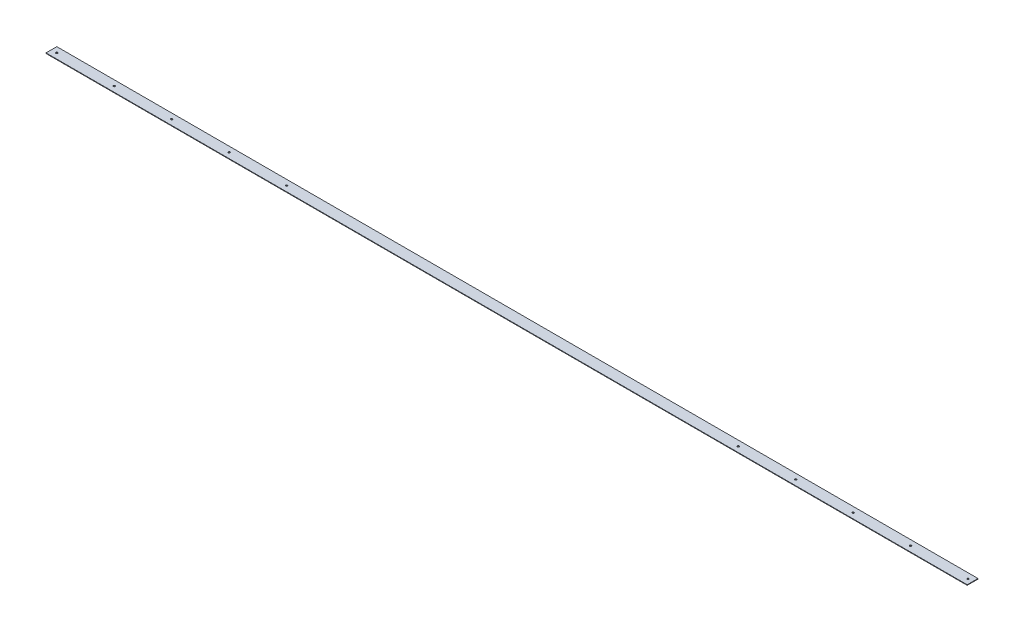
ISO-10303-21;
HEADER;
FILE_DESCRIPTION(('STEP AP214'),'2;1');
FILE_NAME('part.step','',(''),(''),'','','');
FILE_SCHEMA(('AUTOMOTIVE_DESIGN { 1 0 10303 214 1 1 1 1 }'));
ENDSEC;
DATA;
#1=APPLICATION_CONTEXT('core data for automotive mechanical design processes');
#2=APPLICATION_PROTOCOL_DEFINITION('international standard','automotive_design',2000,#1);
#3=PRODUCT_CONTEXT('',#1,'mechanical');
#4=PRODUCT('Part','Part','',(#3));
#5=PRODUCT_RELATED_PRODUCT_CATEGORY('part','',(#4));
#6=PRODUCT_DEFINITION_FORMATION('','',#4);
#7=PRODUCT_DEFINITION_CONTEXT('part definition',#1,'design');
#8=PRODUCT_DEFINITION('design','',#6,#7);
#9=PRODUCT_DEFINITION_SHAPE('','',#8);
#10=(LENGTH_UNIT() NAMED_UNIT(*) SI_UNIT(.MILLI.,.METRE.));
#11=(NAMED_UNIT(*) PLANE_ANGLE_UNIT() SI_UNIT($,.RADIAN.));
#12=(NAMED_UNIT(*) SI_UNIT($,.STERADIAN.) SOLID_ANGLE_UNIT());
#13=UNCERTAINTY_MEASURE_WITH_UNIT(LENGTH_MEASURE(1.E-05),#10,'distance_accuracy_value','');
#14=(GEOMETRIC_REPRESENTATION_CONTEXT(3) GLOBAL_UNCERTAINTY_ASSIGNED_CONTEXT((#13)) GLOBAL_UNIT_ASSIGNED_CONTEXT((#10,
#11,#12)) REPRESENTATION_CONTEXT('',''));
#15=CARTESIAN_POINT('',(0.,0.,0.));
#16=DIRECTION('',(0.,0.,1.));
#17=DIRECTION('',(1.,0.,0.));
#18=AXIS2_PLACEMENT_3D('',#15,#16,#17);
#19=CARTESIAN_POINT('',(-1704.25,2.,20.0000000000002));
#20=DIRECTION('',(1.,0.,0.));
#21=DIRECTION('',(0.,0.,-1.));
#22=AXIS2_PLACEMENT_3D('',#19,#20,#21);
#23=PLANE('',#22);
#24=DIRECTION('',(0.,0.,1.));
#25=VECTOR('',#24,1.);
#26=CARTESIAN_POINT('',(-1704.25,0.,20.0000000000002));
#27=LINE('',#26,#25);
#28=CARTESIAN_POINT('',(-1704.25,0.,-19.9999999999998));
#29=VERTEX_POINT('',#28);
#30=CARTESIAN_POINT('',(-1704.25,0.,20.0000000000002));
#31=VERTEX_POINT('',#30);
#32=EDGE_CURVE('E101',#29,#31,#27,.T.);
#33=ORIENTED_EDGE('',*,*,#32,.T.);
#34=DIRECTION('',(0.,-1.,0.));
#35=VECTOR('',#34,1.);
#36=CARTESIAN_POINT('',(-1704.25,2.,20.0000000000002));
#37=LINE('',#36,#35);
#38=CARTESIAN_POINT('',(-1704.25,2.,20.0000000000002));
#39=VERTEX_POINT('',#38);
#40=EDGE_CURVE('E11',#39,#31,#37,.T.);
#41=ORIENTED_EDGE('',*,*,#40,.F.);
#42=DIRECTION('',(0.,0.,1.));
#43=VECTOR('',#42,1.);
#44=CARTESIAN_POINT('',(-1704.25,2.,20.0000000000002));
#45=LINE('',#44,#43);
#46=CARTESIAN_POINT('',(-1704.25,2.,-19.9999999999998));
#47=VERTEX_POINT('',#46);
#48=EDGE_CURVE('E88',#47,#39,#45,.T.);
#49=ORIENTED_EDGE('',*,*,#48,.F.);
#50=DIRECTION('',(0.,-1.,0.));
#51=VECTOR('',#50,1.);
#52=CARTESIAN_POINT('',(-1704.25,2.,-19.9999999999998));
#53=LINE('',#52,#51);
#54=EDGE_CURVE('E97',#47,#29,#53,.T.);
#55=ORIENTED_EDGE('',*,*,#54,.T.);
#56=EDGE_LOOP('',(#33,#41,#49,#55));
#57=FACE_BOUND('',#56,.T.);
#58=ADVANCED_FACE('F35',(#57),#23,.F.);
#59=CARTESIAN_POINT('',(1704.25,2.,19.9999999999998));
#60=DIRECTION('',(0.,0.,-1.));
#61=DIRECTION('',(-1.,0.,0.));
#62=AXIS2_PLACEMENT_3D('',#59,#60,#61);
#63=PLANE('',#62);
#64=DIRECTION('',(1.,0.,0.));
#65=VECTOR('',#64,1.);
#66=CARTESIAN_POINT('',(1704.25,0.,19.9999999999998));
#67=LINE('',#66,#65);
#68=CARTESIAN_POINT('',(1704.25,0.,19.9999999999998));
#69=VERTEX_POINT('',#68);
#70=EDGE_CURVE('E92',#31,#69,#67,.T.);
#71=ORIENTED_EDGE('',*,*,#70,.T.);
#72=DIRECTION('',(0.,-1.,0.));
#73=VECTOR('',#72,1.);
#74=CARTESIAN_POINT('',(1704.25,2.,19.9999999999998));
#75=LINE('',#74,#73);
#76=CARTESIAN_POINT('',(1704.25,2.,19.9999999999998));
#77=VERTEX_POINT('',#76);
#78=EDGE_CURVE('E44',#77,#69,#75,.T.);
#79=ORIENTED_EDGE('',*,*,#78,.F.);
#80=DIRECTION('',(1.,0.,0.));
#81=VECTOR('',#80,1.);
#82=CARTESIAN_POINT('',(1704.25,2.,19.9999999999998));
#83=LINE('',#82,#81);
#84=EDGE_CURVE('E83',#39,#77,#83,.T.);
#85=ORIENTED_EDGE('',*,*,#84,.F.);
#86=ORIENTED_EDGE('',*,*,#40,.T.);
#87=EDGE_LOOP('',(#71,#79,#85,#86));
#88=FACE_BOUND('',#87,.T.);
#89=ADVANCED_FACE('F91',(#88),#63,.F.);
#90=CARTESIAN_POINT('',(1704.25,2.,19.9999999999998));
#91=DIRECTION('',(-1.,0.,0.));
#92=DIRECTION('',(0.,0.,1.));
#93=AXIS2_PLACEMENT_3D('',#90,#91,#92);
#94=PLANE('',#93);
#95=DIRECTION('',(0.,0.,-1.));
#96=VECTOR('',#95,1.);
#97=CARTESIAN_POINT('',(1704.25,0.,19.9999999999998));
#98=LINE('',#97,#96);
#99=CARTESIAN_POINT('',(1704.25,0.,-20.0000000000002));
#100=VERTEX_POINT('',#99);
#101=EDGE_CURVE('E70',#69,#100,#98,.T.);
#102=ORIENTED_EDGE('',*,*,#101,.T.);
#103=DIRECTION('',(0.,-1.,0.));
#104=VECTOR('',#103,1.);
#105=CARTESIAN_POINT('',(1704.25,2.,-20.0000000000002));
#106=LINE('',#105,#104);
#107=CARTESIAN_POINT('',(1704.25,2.,-20.0000000000002));
#108=VERTEX_POINT('',#107);
#109=EDGE_CURVE('E93',#108,#100,#106,.T.);
#110=ORIENTED_EDGE('',*,*,#109,.F.);
#111=DIRECTION('',(0.,0.,-1.));
#112=VECTOR('',#111,1.);
#113=CARTESIAN_POINT('',(1704.25,2.,19.9999999999998));
#114=LINE('',#113,#112);
#115=EDGE_CURVE('E86',#77,#108,#114,.T.);
#116=ORIENTED_EDGE('',*,*,#115,.F.);
#117=ORIENTED_EDGE('',*,*,#78,.T.);
#118=EDGE_LOOP('',(#102,#110,#116,#117));
#119=FACE_BOUND('',#118,.T.);
#120=ADVANCED_FACE('F95',(#119),#94,.F.);
#121=CARTESIAN_POINT('',(1704.25,2.,-20.0000000000002));
#122=DIRECTION('',(0.,0.,1.));
#123=DIRECTION('',(1.,0.,0.));
#124=AXIS2_PLACEMENT_3D('',#121,#122,#123);
#125=PLANE('',#124);
#126=DIRECTION('',(-1.,0.,0.));
#127=VECTOR('',#126,1.);
#128=CARTESIAN_POINT('',(1704.25,0.,-20.0000000000002));
#129=LINE('',#128,#127);
#130=EDGE_CURVE('E76',#100,#29,#129,.T.);
#131=ORIENTED_EDGE('',*,*,#130,.T.);
#132=ORIENTED_EDGE('',*,*,#54,.F.);
#133=DIRECTION('',(-1.,0.,0.));
#134=VECTOR('',#133,1.);
#135=CARTESIAN_POINT('',(1704.25,2.,-20.0000000000002));
#136=LINE('',#135,#134);
#137=EDGE_CURVE('E53',#108,#47,#136,.T.);
#138=ORIENTED_EDGE('',*,*,#137,.F.);
#139=ORIENTED_EDGE('',*,*,#109,.T.);
#140=EDGE_LOOP('',(#131,#132,#138,#139));
#141=FACE_BOUND('',#140,.T.);
#142=ADVANCED_FACE('F171',(#141),#125,.F.);
#143=CARTESIAN_POINT('',(0.,2.,0.));
#144=DIRECTION('',(0.,1.,0.));
#145=DIRECTION('',(0.,0.,1.));
#146=AXIS2_PLACEMENT_3D('',#143,#144,#145);
#147=PLANE('',#146);
#148=CARTESIAN_POINT('',(-1684.25,2.,2.1163626406917E-13));
#149=DIRECTION('',(0.,1.,0.));
#150=DIRECTION('',(0.,0.,1.));
#151=AXIS2_PLACEMENT_3D('',#148,#149,#150);
#152=CIRCLE('',#151,3.40000000000037);
#153=CARTESIAN_POINT('',(-1684.25,2.,3.40000000000058));
#154=VERTEX_POINT('',#153);
#155=EDGE_CURVE('E113',#154,#154,#152,.T.);
#156=ORIENTED_EDGE('',*,*,#155,.F.);
#157=EDGE_LOOP('',(#156));
#158=FACE_BOUND('',#157,.T.);
#159=CARTESIAN_POINT('',(837.25,2.,6.1471545401025E-12));
#160=DIRECTION('',(0.,1.,0.));
#161=DIRECTION('',(0.,0.,1.));
#162=AXIS2_PLACEMENT_3D('',#159,#160,#161);
#163=CIRCLE('',#162,3.40000000000038);
#164=CARTESIAN_POINT('',(837.25,2.,3.40000000000653));
#165=VERTEX_POINT('',#164);
#166=EDGE_CURVE('E311',#165,#165,#163,.T.);
#167=ORIENTED_EDGE('',*,*,#166,.F.);
#168=EDGE_LOOP('',(#167));
#169=FACE_BOUND('',#168,.T.);
#170=CARTESIAN_POINT('',(1049.75,2.,4.66327497109417E-12));
#171=DIRECTION('',(0.,1.,0.));
#172=DIRECTION('',(0.,0.,1.));
#173=AXIS2_PLACEMENT_3D('',#170,#171,#172);
#174=CIRCLE('',#173,3.40000000000037);
#175=CARTESIAN_POINT('',(1049.75,2.,3.40000000000503));
#176=VERTEX_POINT('',#175);
#177=EDGE_CURVE('E285',#176,#176,#174,.T.);
#178=ORIENTED_EDGE('',*,*,#177,.F.);
#179=EDGE_LOOP('',(#178));
#180=FACE_BOUND('',#179,.T.);
#181=CARTESIAN_POINT('',(1262.25,2.,3.17939540208583E-12));
#182=DIRECTION('',(0.,1.,0.));
#183=DIRECTION('',(0.,0.,1.));
#184=AXIS2_PLACEMENT_3D('',#181,#182,#183);
#185=CIRCLE('',#184,3.40000000000037);
#186=CARTESIAN_POINT('',(1262.25,2.,3.40000000000355));
#187=VERTEX_POINT('',#186);
#188=EDGE_CURVE('E310',#187,#187,#185,.T.);
#189=ORIENTED_EDGE('',*,*,#188,.F.);
#190=EDGE_LOOP('',(#189));
#191=FACE_BOUND('',#190,.T.);
#192=CARTESIAN_POINT('',(1474.75,2.,1.6955158330775E-12));
#193=DIRECTION('',(0.,1.,0.));
#194=DIRECTION('',(0.,0.,1.));
#195=AXIS2_PLACEMENT_3D('',#192,#193,#194);
#196=CIRCLE('',#195,3.40000000000037);
#197=CARTESIAN_POINT('',(1474.75,2.,3.40000000000206));
#198=VERTEX_POINT('',#197);
#199=EDGE_CURVE('E314',#198,#198,#196,.T.);
#200=ORIENTED_EDGE('',*,*,#199,.F.);
#201=EDGE_LOOP('',(#200));
#202=FACE_BOUND('',#201,.T.);
#203=CARTESIAN_POINT('',(1687.25,2.,2.1163626406917E-13));
#204=DIRECTION('',(0.,1.,0.));
#205=DIRECTION('',(0.,0.,1.));
#206=AXIS2_PLACEMENT_3D('',#203,#204,#205);
#207=CIRCLE('',#206,3.40000000000037);
#208=CARTESIAN_POINT('',(1687.25,2.,3.40000000000058));
#209=VERTEX_POINT('',#208);
#210=EDGE_CURVE('E321',#209,#209,#207,.T.);
#211=ORIENTED_EDGE('',*,*,#210,.F.);
#212=EDGE_LOOP('',(#211));
#213=FACE_BOUND('',#212,.T.);
#214=CARTESIAN_POINT('',(-834.25,2.,2.1163626406917E-13));
#215=DIRECTION('',(0.,1.,0.));
#216=DIRECTION('',(0.,0.,1.));
#217=AXIS2_PLACEMENT_3D('',#214,#215,#216);
#218=CIRCLE('',#217,3.40000000000038);
#219=CARTESIAN_POINT('',(-834.25,2.,3.40000000000059));
#220=VERTEX_POINT('',#219);
#221=EDGE_CURVE('E324',#220,#220,#218,.T.);
#222=ORIENTED_EDGE('',*,*,#221,.F.);
#223=EDGE_LOOP('',(#222));
#224=FACE_BOUND('',#223,.T.);
#225=CARTESIAN_POINT('',(-1046.75,2.,2.1163626406917E-13));
#226=DIRECTION('',(0.,1.,0.));
#227=DIRECTION('',(0.,0.,1.));
#228=AXIS2_PLACEMENT_3D('',#225,#226,#227);
#229=CIRCLE('',#228,3.40000000000037);
#230=CARTESIAN_POINT('',(-1046.75,2.,3.40000000000058));
#231=VERTEX_POINT('',#230);
#232=EDGE_CURVE('E327',#231,#231,#229,.T.);
#233=ORIENTED_EDGE('',*,*,#232,.F.);
#234=EDGE_LOOP('',(#233));
#235=FACE_BOUND('',#234,.T.);
#236=CARTESIAN_POINT('',(-1259.25,2.,2.1163626406917E-13));
#237=DIRECTION('',(0.,1.,0.));
#238=DIRECTION('',(0.,0.,1.));
#239=AXIS2_PLACEMENT_3D('',#236,#237,#238);
#240=CIRCLE('',#239,3.40000000000037);
#241=CARTESIAN_POINT('',(-1259.25,2.,3.40000000000058));
#242=VERTEX_POINT('',#241);
#243=EDGE_CURVE('E330',#242,#242,#240,.T.);
#244=ORIENTED_EDGE('',*,*,#243,.F.);
#245=EDGE_LOOP('',(#244));
#246=FACE_BOUND('',#245,.T.);
#247=CARTESIAN_POINT('',(-1471.75,2.,2.1163626406917E-13));
#248=DIRECTION('',(0.,1.,0.));
#249=DIRECTION('',(0.,0.,1.));
#250=AXIS2_PLACEMENT_3D('',#247,#248,#249);
#251=CIRCLE('',#250,3.40000000000037);
#252=CARTESIAN_POINT('',(-1471.75,2.,3.40000000000058));
#253=VERTEX_POINT('',#252);
#254=EDGE_CURVE('E333',#253,#253,#251,.T.);
#255=ORIENTED_EDGE('',*,*,#254,.F.);
#256=EDGE_LOOP('',(#255));
#257=FACE_BOUND('',#256,.T.);
#258=ORIENTED_EDGE('',*,*,#48,.T.);
#259=ORIENTED_EDGE('',*,*,#84,.T.);
#260=ORIENTED_EDGE('',*,*,#115,.T.);
#261=ORIENTED_EDGE('',*,*,#137,.T.);
#262=EDGE_LOOP('',(#258,#259,#260,#261));
#263=FACE_BOUND('',#262,.T.);
#264=ADVANCED_FACE('F84',(#158,#169,#180,#191,#202,#213,#224,#235,#246,#257,#263),#147,.T.);
#265=CARTESIAN_POINT('',(0.,0.,0.));
#266=DIRECTION('',(0.,1.,0.));
#267=DIRECTION('',(0.,0.,1.));
#268=AXIS2_PLACEMENT_3D('',#265,#266,#267);
#269=PLANE('',#268);
#270=CARTESIAN_POINT('',(-1684.25,0.,2.1163626406917E-13));
#271=DIRECTION('',(0.,1.,0.));
#272=DIRECTION('',(0.,0.,1.));
#273=AXIS2_PLACEMENT_3D('',#270,#271,#272);
#274=CIRCLE('',#273,3.40000000000037);
#275=CARTESIAN_POINT('',(-1684.25,0.,3.40000000000058));
#276=VERTEX_POINT('',#275);
#277=EDGE_CURVE('E38',#276,#276,#274,.T.);
#278=ORIENTED_EDGE('',*,*,#277,.T.);
#279=EDGE_LOOP('',(#278));
#280=FACE_BOUND('',#279,.T.);
#281=CARTESIAN_POINT('',(837.25,0.,6.1471545401025E-12));
#282=DIRECTION('',(0.,1.,0.));
#283=DIRECTION('',(0.,0.,1.));
#284=AXIS2_PLACEMENT_3D('',#281,#282,#283);
#285=CIRCLE('',#284,3.40000000000038);
#286=CARTESIAN_POINT('',(837.25,0.,3.40000000000653));
#287=VERTEX_POINT('',#286);
#288=EDGE_CURVE('E133',#287,#287,#285,.T.);
#289=ORIENTED_EDGE('',*,*,#288,.T.);
#290=EDGE_LOOP('',(#289));
#291=FACE_BOUND('',#290,.T.);
#292=CARTESIAN_POINT('',(1049.75,0.,4.66327497109417E-12));
#293=DIRECTION('',(0.,1.,0.));
#294=DIRECTION('',(0.,0.,1.));
#295=AXIS2_PLACEMENT_3D('',#292,#293,#294);
#296=CIRCLE('',#295,3.40000000000037);
#297=CARTESIAN_POINT('',(1049.75,0.,3.40000000000503));
#298=VERTEX_POINT('',#297);
#299=EDGE_CURVE('E131',#298,#298,#296,.T.);
#300=ORIENTED_EDGE('',*,*,#299,.T.);
#301=EDGE_LOOP('',(#300));
#302=FACE_BOUND('',#301,.T.);
#303=CARTESIAN_POINT('',(1262.25,0.,3.17939540208583E-12));
#304=DIRECTION('',(0.,1.,0.));
#305=DIRECTION('',(0.,0.,1.));
#306=AXIS2_PLACEMENT_3D('',#303,#304,#305);
#307=CIRCLE('',#306,3.40000000000037);
#308=CARTESIAN_POINT('',(1262.25,0.,3.40000000000355));
#309=VERTEX_POINT('',#308);
#310=EDGE_CURVE('E128',#309,#309,#307,.T.);
#311=ORIENTED_EDGE('',*,*,#310,.T.);
#312=EDGE_LOOP('',(#311));
#313=FACE_BOUND('',#312,.T.);
#314=CARTESIAN_POINT('',(1474.75,0.,1.6955158330775E-12));
#315=DIRECTION('',(0.,1.,0.));
#316=DIRECTION('',(0.,0.,1.));
#317=AXIS2_PLACEMENT_3D('',#314,#315,#316);
#318=CIRCLE('',#317,3.40000000000037);
#319=CARTESIAN_POINT('',(1474.75,0.,3.40000000000206));
#320=VERTEX_POINT('',#319);
#321=EDGE_CURVE('E125',#320,#320,#318,.T.);
#322=ORIENTED_EDGE('',*,*,#321,.T.);
#323=EDGE_LOOP('',(#322));
#324=FACE_BOUND('',#323,.T.);
#325=CARTESIAN_POINT('',(1687.25,0.,2.1163626406917E-13));
#326=DIRECTION('',(0.,1.,0.));
#327=DIRECTION('',(0.,0.,1.));
#328=AXIS2_PLACEMENT_3D('',#325,#326,#327);
#329=CIRCLE('',#328,3.40000000000037);
#330=CARTESIAN_POINT('',(1687.25,0.,3.40000000000058));
#331=VERTEX_POINT('',#330);
#332=EDGE_CURVE('E122',#331,#331,#329,.T.);
#333=ORIENTED_EDGE('',*,*,#332,.T.);
#334=EDGE_LOOP('',(#333));
#335=FACE_BOUND('',#334,.T.);
#336=CARTESIAN_POINT('',(-834.25,0.,2.1163626406917E-13));
#337=DIRECTION('',(0.,1.,0.));
#338=DIRECTION('',(0.,0.,1.));
#339=AXIS2_PLACEMENT_3D('',#336,#337,#338);
#340=CIRCLE('',#339,3.40000000000038);
#341=CARTESIAN_POINT('',(-834.25,0.,3.40000000000059));
#342=VERTEX_POINT('',#341);
#343=EDGE_CURVE('E119',#342,#342,#340,.T.);
#344=ORIENTED_EDGE('',*,*,#343,.T.);
#345=EDGE_LOOP('',(#344));
#346=FACE_BOUND('',#345,.T.);
#347=CARTESIAN_POINT('',(-1046.75,0.,2.1163626406917E-13));
#348=DIRECTION('',(0.,1.,0.));
#349=DIRECTION('',(0.,0.,1.));
#350=AXIS2_PLACEMENT_3D('',#347,#348,#349);
#351=CIRCLE('',#350,3.40000000000037);
#352=CARTESIAN_POINT('',(-1046.75,0.,3.40000000000058));
#353=VERTEX_POINT('',#352);
#354=EDGE_CURVE('E116',#353,#353,#351,.T.);
#355=ORIENTED_EDGE('',*,*,#354,.T.);
#356=EDGE_LOOP('',(#355));
#357=FACE_BOUND('',#356,.T.);
#358=CARTESIAN_POINT('',(-1259.25,0.,2.1163626406917E-13));
#359=DIRECTION('',(0.,1.,0.));
#360=DIRECTION('',(0.,0.,1.));
#361=AXIS2_PLACEMENT_3D('',#358,#359,#360);
#362=CIRCLE('',#361,3.40000000000037);
#363=CARTESIAN_POINT('',(-1259.25,0.,3.40000000000058));
#364=VERTEX_POINT('',#363);
#365=EDGE_CURVE('E112',#364,#364,#362,.T.);
#366=ORIENTED_EDGE('',*,*,#365,.T.);
#367=EDGE_LOOP('',(#366));
#368=FACE_BOUND('',#367,.T.);
#369=CARTESIAN_POINT('',(-1471.75,0.,2.1163626406917E-13));
#370=DIRECTION('',(0.,1.,0.));
#371=DIRECTION('',(0.,0.,1.));
#372=AXIS2_PLACEMENT_3D('',#369,#370,#371);
#373=CIRCLE('',#372,3.40000000000037);
#374=CARTESIAN_POINT('',(-1471.75,0.,3.40000000000058));
#375=VERTEX_POINT('',#374);
#376=EDGE_CURVE('E109',#375,#375,#373,.T.);
#377=ORIENTED_EDGE('',*,*,#376,.T.);
#378=EDGE_LOOP('',(#377));
#379=FACE_BOUND('',#378,.T.);
#380=ORIENTED_EDGE('',*,*,#32,.F.);
#381=ORIENTED_EDGE('',*,*,#130,.F.);
#382=ORIENTED_EDGE('',*,*,#101,.F.);
#383=ORIENTED_EDGE('',*,*,#70,.F.);
#384=EDGE_LOOP('',(#380,#381,#382,#383));
#385=FACE_BOUND('',#384,.T.);
#386=ADVANCED_FACE('F140',(#280,#291,#302,#313,#324,#335,#346,#357,#368,#379,#385),#269,.F.);
#387=CARTESIAN_POINT('',(-1471.75,-8.,2.1163626406917E-13));
#388=DIRECTION('',(0.,1.,0.));
#389=DIRECTION('',(0.,0.,1.));
#390=AXIS2_PLACEMENT_3D('',#387,#388,#389);
#391=CYLINDRICAL_SURFACE('',#390,3.40000000000037);
#392=ORIENTED_EDGE('',*,*,#254,.T.);
#393=EDGE_LOOP('',(#392));
#394=FACE_BOUND('',#393,.T.);
#395=ORIENTED_EDGE('',*,*,#376,.F.);
#396=EDGE_LOOP('',(#395));
#397=FACE_BOUND('',#396,.T.);
#398=ADVANCED_FACE('F162',(#394,#397),#391,.F.);
#399=CARTESIAN_POINT('',(-1259.25,-8.,2.1163626406917E-13));
#400=DIRECTION('',(0.,1.,0.));
#401=DIRECTION('',(0.,0.,1.));
#402=AXIS2_PLACEMENT_3D('',#399,#400,#401);
#403=CYLINDRICAL_SURFACE('',#402,3.40000000000037);
#404=ORIENTED_EDGE('',*,*,#243,.T.);
#405=EDGE_LOOP('',(#404));
#406=FACE_BOUND('',#405,.T.);
#407=ORIENTED_EDGE('',*,*,#365,.F.);
#408=EDGE_LOOP('',(#407));
#409=FACE_BOUND('',#408,.T.);
#410=ADVANCED_FACE('F168',(#406,#409),#403,.F.);
#411=CARTESIAN_POINT('',(-1046.75,-8.,2.1163626406917E-13));
#412=DIRECTION('',(0.,1.,0.));
#413=DIRECTION('',(0.,0.,1.));
#414=AXIS2_PLACEMENT_3D('',#411,#412,#413);
#415=CYLINDRICAL_SURFACE('',#414,3.40000000000037);
#416=ORIENTED_EDGE('',*,*,#232,.T.);
#417=EDGE_LOOP('',(#416));
#418=FACE_BOUND('',#417,.T.);
#419=ORIENTED_EDGE('',*,*,#354,.F.);
#420=EDGE_LOOP('',(#419));
#421=FACE_BOUND('',#420,.T.);
#422=ADVANCED_FACE('F210',(#418,#421),#415,.F.);
#423=CARTESIAN_POINT('',(-834.25,-8.,2.1163626406917E-13));
#424=DIRECTION('',(0.,1.,0.));
#425=DIRECTION('',(0.,0.,1.));
#426=AXIS2_PLACEMENT_3D('',#423,#424,#425);
#427=CYLINDRICAL_SURFACE('',#426,3.40000000000038);
#428=ORIENTED_EDGE('',*,*,#221,.T.);
#429=EDGE_LOOP('',(#428));
#430=FACE_BOUND('',#429,.T.);
#431=ORIENTED_EDGE('',*,*,#343,.F.);
#432=EDGE_LOOP('',(#431));
#433=FACE_BOUND('',#432,.T.);
#434=ADVANCED_FACE('F220',(#430,#433),#427,.F.);
#435=CARTESIAN_POINT('',(1687.25,-8.,2.1163626406917E-13));
#436=DIRECTION('',(0.,1.,0.));
#437=DIRECTION('',(0.,0.,1.));
#438=AXIS2_PLACEMENT_3D('',#435,#436,#437);
#439=CYLINDRICAL_SURFACE('',#438,3.40000000000037);
#440=ORIENTED_EDGE('',*,*,#210,.T.);
#441=EDGE_LOOP('',(#440));
#442=FACE_BOUND('',#441,.T.);
#443=ORIENTED_EDGE('',*,*,#332,.F.);
#444=EDGE_LOOP('',(#443));
#445=FACE_BOUND('',#444,.T.);
#446=ADVANCED_FACE('F230',(#442,#445),#439,.F.);
#447=CARTESIAN_POINT('',(1474.75,-8.,1.6955158330775E-12));
#448=DIRECTION('',(0.,1.,0.));
#449=DIRECTION('',(0.,0.,1.));
#450=AXIS2_PLACEMENT_3D('',#447,#448,#449);
#451=CYLINDRICAL_SURFACE('',#450,3.40000000000037);
#452=ORIENTED_EDGE('',*,*,#199,.T.);
#453=EDGE_LOOP('',(#452));
#454=FACE_BOUND('',#453,.T.);
#455=ORIENTED_EDGE('',*,*,#321,.F.);
#456=EDGE_LOOP('',(#455));
#457=FACE_BOUND('',#456,.T.);
#458=ADVANCED_FACE('F240',(#454,#457),#451,.F.);
#459=CARTESIAN_POINT('',(1262.25,-8.,3.17939540208583E-12));
#460=DIRECTION('',(0.,1.,0.));
#461=DIRECTION('',(0.,0.,1.));
#462=AXIS2_PLACEMENT_3D('',#459,#460,#461);
#463=CYLINDRICAL_SURFACE('',#462,3.40000000000037);
#464=ORIENTED_EDGE('',*,*,#188,.T.);
#465=EDGE_LOOP('',(#464));
#466=FACE_BOUND('',#465,.T.);
#467=ORIENTED_EDGE('',*,*,#310,.F.);
#468=EDGE_LOOP('',(#467));
#469=FACE_BOUND('',#468,.T.);
#470=ADVANCED_FACE('F250',(#466,#469),#463,.F.);
#471=CARTESIAN_POINT('',(1049.75,-8.,4.66327497109417E-12));
#472=DIRECTION('',(0.,1.,0.));
#473=DIRECTION('',(0.,0.,1.));
#474=AXIS2_PLACEMENT_3D('',#471,#472,#473);
#475=CYLINDRICAL_SURFACE('',#474,3.40000000000037);
#476=ORIENTED_EDGE('',*,*,#177,.T.);
#477=EDGE_LOOP('',(#476));
#478=FACE_BOUND('',#477,.T.);
#479=ORIENTED_EDGE('',*,*,#299,.F.);
#480=EDGE_LOOP('',(#479));
#481=FACE_BOUND('',#480,.T.);
#482=ADVANCED_FACE('F150',(#478,#481),#475,.F.);
#483=CARTESIAN_POINT('',(837.25,-8.,6.1471545401025E-12));
#484=DIRECTION('',(0.,1.,0.));
#485=DIRECTION('',(0.,0.,1.));
#486=AXIS2_PLACEMENT_3D('',#483,#484,#485);
#487=CYLINDRICAL_SURFACE('',#486,3.40000000000038);
#488=ORIENTED_EDGE('',*,*,#166,.T.);
#489=EDGE_LOOP('',(#488));
#490=FACE_BOUND('',#489,.T.);
#491=ORIENTED_EDGE('',*,*,#288,.F.);
#492=EDGE_LOOP('',(#491));
#493=FACE_BOUND('',#492,.T.);
#494=ADVANCED_FACE('F144',(#490,#493),#487,.F.);
#495=CARTESIAN_POINT('',(-1684.25,-8.,2.1163626406917E-13));
#496=DIRECTION('',(0.,1.,0.));
#497=DIRECTION('',(0.,0.,1.));
#498=AXIS2_PLACEMENT_3D('',#495,#496,#497);
#499=CYLINDRICAL_SURFACE('',#498,3.40000000000037);
#500=ORIENTED_EDGE('',*,*,#155,.T.);
#501=EDGE_LOOP('',(#500));
#502=FACE_BOUND('',#501,.T.);
#503=ORIENTED_EDGE('',*,*,#277,.F.);
#504=EDGE_LOOP('',(#503));
#505=FACE_BOUND('',#504,.T.);
#506=ADVANCED_FACE('F142',(#502,#505),#499,.F.);
#507=CLOSED_SHELL('',(#58,#89,#120,#142,#264,#386,#398,#410,#422,#434,#446,#458,#470,#482,#494,#506));
#508=MANIFOLD_SOLID_BREP('B2',#507);
#509=ADVANCED_BREP_SHAPE_REPRESENTATION('',(#18,#508),#14);
#510=SHAPE_DEFINITION_REPRESENTATION(#9,#509);
ENDSEC;
END-ISO-10303-21;
